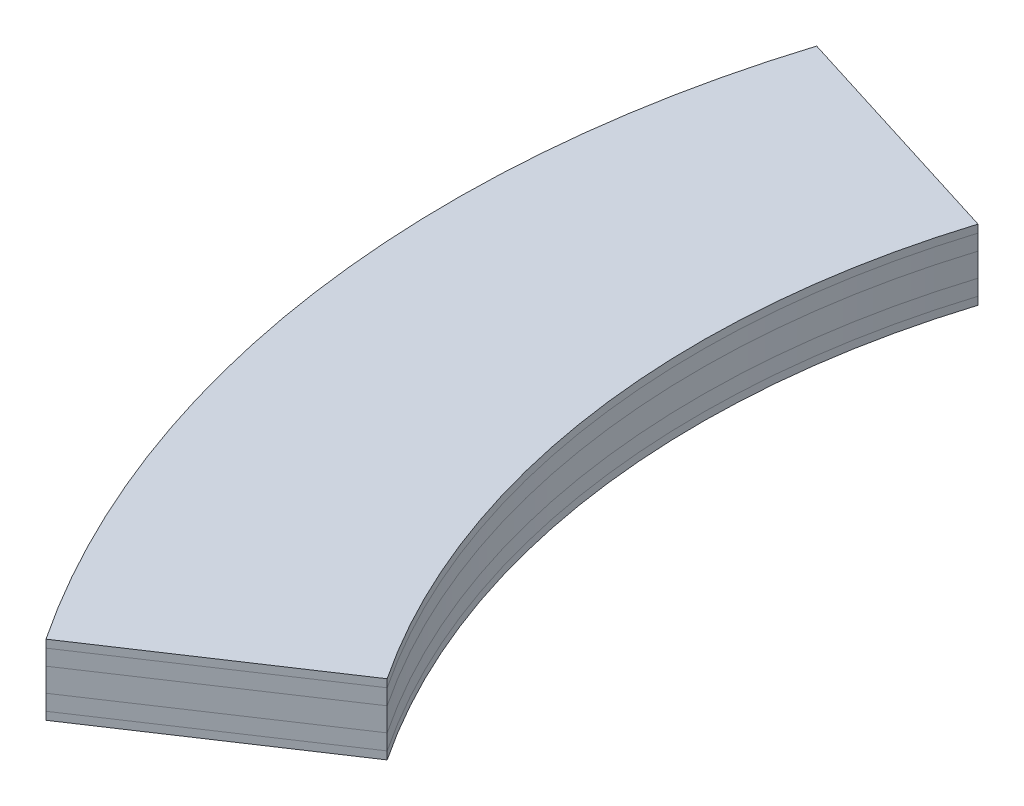
ISO-10303-21;
HEADER;
FILE_DESCRIPTION(('STEP AP214'),'2;1');
FILE_NAME('part.step','',(''),(''),'','','');
FILE_SCHEMA(('AUTOMOTIVE_DESIGN { 1 0 10303 214 1 1 1 1 }'));
ENDSEC;
DATA;
#1=APPLICATION_CONTEXT('core data for automotive mechanical design processes');
#2=APPLICATION_PROTOCOL_DEFINITION('international standard','automotive_design',2000,#1);
#3=PRODUCT_CONTEXT('',#1,'mechanical');
#4=PRODUCT('Part','Part','',(#3));
#5=PRODUCT_RELATED_PRODUCT_CATEGORY('part','',(#4));
#6=PRODUCT_DEFINITION_FORMATION('','',#4);
#7=PRODUCT_DEFINITION_CONTEXT('part definition',#1,'design');
#8=PRODUCT_DEFINITION('design','',#6,#7);
#9=PRODUCT_DEFINITION_SHAPE('','',#8);
#10=(LENGTH_UNIT() NAMED_UNIT(*) SI_UNIT(.MILLI.,.METRE.));
#11=(NAMED_UNIT(*) PLANE_ANGLE_UNIT() SI_UNIT($,.RADIAN.));
#12=(NAMED_UNIT(*) SI_UNIT($,.STERADIAN.) SOLID_ANGLE_UNIT());
#13=UNCERTAINTY_MEASURE_WITH_UNIT(LENGTH_MEASURE(1.E-05),#10,'distance_accuracy_value','');
#14=(GEOMETRIC_REPRESENTATION_CONTEXT(3) GLOBAL_UNCERTAINTY_ASSIGNED_CONTEXT((#13)) GLOBAL_UNIT_ASSIGNED_CONTEXT((#10,
#11,#12)) REPRESENTATION_CONTEXT('',''));
#15=CARTESIAN_POINT('',(0.,0.,0.));
#16=DIRECTION('',(0.,0.,1.));
#17=DIRECTION('',(1.,0.,0.));
#18=AXIS2_PLACEMENT_3D('',#15,#16,#17);
#19=CARTESIAN_POINT('',(0.,0.,0.));
#20=DIRECTION('',(0.,1.,0.));
#21=DIRECTION('',(0.,0.,1.));
#22=AXIS2_PLACEMENT_3D('',#19,#20,#21);
#23=PLANE('',#22);
#24=DIRECTION('',(-0.954350259490741,0.,-0.298689775871144));
#25=VECTOR('',#24,1.);
#26=CARTESIAN_POINT('',(46.2703573815659,0.,-282.443495848509));
#27=LINE('',#26,#25);
#28=CARTESIAN_POINT('',(131.112095450293,0.,-255.889974773564));
#29=VERTEX_POINT('',#28);
#30=CARTESIAN_POINT('',(46.2703573815659,0.,-282.443495848509));
#31=VERTEX_POINT('',#30);
#32=EDGE_CURVE('E100',#29,#31,#27,.T.);
#33=ORIENTED_EDGE('',*,*,#32,.T.);
#34=CARTESIAN_POINT('',(409.877806247538,0.,-168.642691241603));
#35=DIRECTION('',(0.,1.,0.));
#36=DIRECTION('',(0.,0.,-1.));
#37=AXIS2_PLACEMENT_3D('',#34,#35,#36);
#38=CIRCLE('',#37,381.);
#39=CARTESIAN_POINT('',(92.6123886277605,0.,42.316202343256));
#40=VERTEX_POINT('',#39);
#41=EDGE_CURVE('E110',#31,#40,#38,.T.);
#42=ORIENTED_EDGE('',*,*,#41,.T.);
#43=DIRECTION('',(0.832717631547974,0.,-0.553697883424827));
#44=VECTOR('',#43,1.);
#45=CARTESIAN_POINT('',(92.6123886277605,0.,42.3162023432561));
#46=LINE('',#45,#44);
#47=CARTESIAN_POINT('',(166.640986072375,0.,-6.907539493211));
#48=VERTEX_POINT('',#47);
#49=EDGE_CURVE('E108',#40,#48,#46,.T.);
#50=ORIENTED_EDGE('',*,*,#49,.T.);
#51=CARTESIAN_POINT('',(409.877806247538,0.,-168.642691241603));
#52=DIRECTION('',(0.,-1.,0.));
#53=DIRECTION('',(0.,0.,-1.));
#54=AXIS2_PLACEMENT_3D('',#51,#52,#53);
#55=CIRCLE('',#54,292.1);
#56=EDGE_CURVE('E72',#48,#29,#55,.T.);
#57=ORIENTED_EDGE('',*,*,#56,.T.);
#58=EDGE_LOOP('',(#33,#42,#50,#57));
#59=FACE_BOUND('',#58,.T.);
#60=ADVANCED_FACE('F49',(#59),#23,.T.);
#61=CARTESIAN_POINT('',(409.877806247538,-25.4,-168.642691241603));
#62=DIRECTION('',(0.,1.,0.));
#63=DIRECTION('',(0.,0.,1.));
#64=AXIS2_PLACEMENT_3D('',#61,#62,#63);
#65=CYLINDRICAL_SURFACE('',#64,381.);
#66=DIRECTION('',(0.,1.,0.));
#67=VECTOR('',#66,1.);
#68=CARTESIAN_POINT('',(92.6123886277605,-25.4,42.3162023432561));
#69=LINE('',#68,#67);
#70=CARTESIAN_POINT('',(92.6123886277605,-2.82222222222214,42.3162023432559));
#71=VERTEX_POINT('',#70);
#72=EDGE_CURVE('E64',#71,#40,#69,.T.);
#73=ORIENTED_EDGE('',*,*,#72,.T.);
#74=ORIENTED_EDGE('',*,*,#41,.F.);
#75=DIRECTION('',(0.,1.,0.));
#76=VECTOR('',#75,1.);
#77=CARTESIAN_POINT('',(46.2703573815659,-25.4,-282.443495848509));
#78=LINE('',#77,#76);
#79=CARTESIAN_POINT('',(46.2703573815659,-2.82222222222214,-282.443495848509));
#80=VERTEX_POINT('',#79);
#81=EDGE_CURVE('E96',#80,#31,#78,.T.);
#82=ORIENTED_EDGE('',*,*,#81,.F.);
#83=CARTESIAN_POINT('',(409.877806247538,-2.82222222222209,-168.642691241603));
#84=DIRECTION('',(0.,-1.,0.));
#85=DIRECTION('',(1.,0.,0.));
#86=AXIS2_PLACEMENT_3D('',#83,#84,#85);
#87=CIRCLE('',#86,381.);
#88=EDGE_CURVE('E12',#71,#80,#87,.T.);
#89=ORIENTED_EDGE('',*,*,#88,.F.);
#90=EDGE_LOOP('',(#73,#74,#82,#89));
#91=FACE_BOUND('',#90,.T.);
#92=ADVANCED_FACE('F122',(#91),#65,.T.);
#93=CARTESIAN_POINT('',(46.2703573815659,-25.4,-282.443495848509));
#94=DIRECTION('',(0.298689775871144,0.,-0.954350259490741));
#95=DIRECTION('',(-0.954350259490742,0.,-0.298689775871144));
#96=AXIS2_PLACEMENT_3D('',#93,#94,#95);
#97=PLANE('',#96);
#98=ORIENTED_EDGE('',*,*,#81,.T.);
#99=ORIENTED_EDGE('',*,*,#32,.F.);
#100=DIRECTION('',(0.,1.,0.));
#101=VECTOR('',#100,1.);
#102=CARTESIAN_POINT('',(131.112095450293,-25.4,-255.889974773564));
#103=LINE('',#102,#101);
#104=CARTESIAN_POINT('',(131.112095450293,-2.82222222222203,-255.889974773564));
#105=VERTEX_POINT('',#104);
#106=EDGE_CURVE('E89',#105,#29,#103,.T.);
#107=ORIENTED_EDGE('',*,*,#106,.F.);
#108=DIRECTION('',(0.954350259490742,0.,0.298689775871144));
#109=VECTOR('',#108,1.);
#110=CARTESIAN_POINT('',(-394.500100999854,-2.82222222222223,-420.394555341928));
#111=LINE('',#110,#109);
#112=EDGE_CURVE('E57',#80,#105,#111,.T.);
#113=ORIENTED_EDGE('',*,*,#112,.F.);
#114=EDGE_LOOP('',(#98,#99,#107,#113));
#115=FACE_BOUND('',#114,.T.);
#116=ADVANCED_FACE('F101',(#115),#97,.T.);
#117=CARTESIAN_POINT('',(409.877806247538,-25.4,-168.642691241603));
#118=DIRECTION('',(0.,1.,0.));
#119=DIRECTION('',(0.,0.,1.));
#120=AXIS2_PLACEMENT_3D('',#117,#118,#119);
#121=CYLINDRICAL_SURFACE('',#120,292.1);
#122=ORIENTED_EDGE('',*,*,#106,.T.);
#123=ORIENTED_EDGE('',*,*,#56,.F.);
#124=DIRECTION('',(0.,1.,0.));
#125=VECTOR('',#124,1.);
#126=CARTESIAN_POINT('',(166.640986072375,-25.4,-6.907539493211));
#127=LINE('',#126,#125);
#128=CARTESIAN_POINT('',(166.640986072375,-2.82222222222214,-6.907539493211));
#129=VERTEX_POINT('',#128);
#130=EDGE_CURVE('E97',#129,#48,#127,.T.);
#131=ORIENTED_EDGE('',*,*,#130,.F.);
#132=CARTESIAN_POINT('',(409.877806247538,-2.82222222222209,-168.642691241603));
#133=DIRECTION('',(0.,-1.,0.));
#134=DIRECTION('',(1.,0.,0.));
#135=AXIS2_PLACEMENT_3D('',#132,#133,#134);
#136=CIRCLE('',#135,292.1);
#137=EDGE_CURVE('E93',#105,#129,#136,.F.);
#138=ORIENTED_EDGE('',*,*,#137,.F.);
#139=EDGE_LOOP('',(#122,#123,#131,#138));
#140=FACE_BOUND('',#139,.T.);
#141=ADVANCED_FACE('F91',(#140),#121,.F.);
#142=CARTESIAN_POINT('',(92.6123886277605,-25.4,42.3162023432561));
#143=DIRECTION('',(0.553697883424827,0.,0.832717631547973));
#144=DIRECTION('',(0.832717631547973,0.,-0.553697883424827));
#145=AXIS2_PLACEMENT_3D('',#142,#143,#144);
#146=PLANE('',#145);
#147=ORIENTED_EDGE('',*,*,#130,.T.);
#148=ORIENTED_EDGE('',*,*,#49,.F.);
#149=ORIENTED_EDGE('',*,*,#72,.F.);
#150=DIRECTION('',(-0.832717631547973,0.,0.553697883424827));
#151=VECTOR('',#150,1.);
#152=CARTESIAN_POINT('',(96.4900398465763,-2.82222222222214,39.7378406139303));
#153=LINE('',#152,#151);
#154=EDGE_CURVE('E114',#129,#71,#153,.T.);
#155=ORIENTED_EDGE('',*,*,#154,.F.);
#156=EDGE_LOOP('',(#147,#148,#149,#155));
#157=FACE_BOUND('',#156,.T.);
#158=ADVANCED_FACE('F123',(#157),#146,.T.);
#159=CARTESIAN_POINT('',(-335.28,-2.82222222222222,-609.61));
#160=DIRECTION('',(0.,-1.,0.));
#161=DIRECTION('',(1.,0.,0.));
#162=AXIS2_PLACEMENT_3D('',#159,#160,#161);
#163=PLANE('',#162);
#164=ORIENTED_EDGE('',*,*,#154,.T.);
#165=ORIENTED_EDGE('',*,*,#88,.T.);
#166=ORIENTED_EDGE('',*,*,#112,.T.);
#167=ORIENTED_EDGE('',*,*,#137,.T.);
#168=EDGE_LOOP('',(#164,#165,#166,#167));
#169=FACE_BOUND('',#168,.T.);
#170=ADVANCED_FACE('F51',(#169),#163,.T.);
#171=CLOSED_SHELL('',(#60,#92,#116,#141,#158,#170));
#172=MANIFOLD_SOLID_BREP('B2',#171);
#173=CARTESIAN_POINT('',(0.,-25.4,0.));
#174=DIRECTION('',(0.,1.,0.));
#175=DIRECTION('',(0.,0.,1.));
#176=AXIS2_PLACEMENT_3D('',#173,#174,#175);
#177=PLANE('',#176);
#178=CARTESIAN_POINT('',(409.877806247538,-25.4,-168.642691241603));
#179=DIRECTION('',(0.,1.,0.));
#180=DIRECTION('',(0.,0.,-1.));
#181=AXIS2_PLACEMENT_3D('',#178,#179,#180);
#182=CIRCLE('',#181,381.);
#183=CARTESIAN_POINT('',(46.2703573815659,-25.4,-282.443495848509));
#184=VERTEX_POINT('',#183);
#185=CARTESIAN_POINT('',(92.6123886277605,-25.4,42.316202343256));
#186=VERTEX_POINT('',#185);
#187=EDGE_CURVE('E205',#184,#186,#182,.T.);
#188=ORIENTED_EDGE('',*,*,#187,.F.);
#189=DIRECTION('',(-0.954350259490741,0.,-0.298689775871144));
#190=VECTOR('',#189,1.);
#191=CARTESIAN_POINT('',(46.2703573815659,-25.4,-282.443495848509));
#192=LINE('',#191,#190);
#193=CARTESIAN_POINT('',(131.112095450293,-25.4,-255.889974773564));
#194=VERTEX_POINT('',#193);
#195=EDGE_CURVE('E228',#194,#184,#192,.T.);
#196=ORIENTED_EDGE('',*,*,#195,.F.);
#197=CARTESIAN_POINT('',(409.877806247538,-25.4,-168.642691241603));
#198=DIRECTION('',(0.,-1.,0.));
#199=DIRECTION('',(0.,0.,-1.));
#200=AXIS2_PLACEMENT_3D('',#197,#198,#199);
#201=CIRCLE('',#200,292.1);
#202=CARTESIAN_POINT('',(166.640986072375,-25.4,-6.907539493211));
#203=VERTEX_POINT('',#202);
#204=EDGE_CURVE('E235',#203,#194,#201,.T.);
#205=ORIENTED_EDGE('',*,*,#204,.F.);
#206=DIRECTION('',(0.832717631547974,0.,-0.553697883424827));
#207=VECTOR('',#206,1.);
#208=CARTESIAN_POINT('',(92.6123886277605,-25.4,42.3162023432561));
#209=LINE('',#208,#207);
#210=EDGE_CURVE('E239',#186,#203,#209,.T.);
#211=ORIENTED_EDGE('',*,*,#210,.F.);
#212=EDGE_LOOP('',(#188,#196,#205,#211));
#213=FACE_BOUND('',#212,.T.);
#214=ADVANCED_FACE('F182',(#213),#177,.F.);
#215=CARTESIAN_POINT('',(409.877806247538,-25.4,-168.642691241603));
#216=DIRECTION('',(0.,1.,0.));
#217=DIRECTION('',(0.,0.,1.));
#218=AXIS2_PLACEMENT_3D('',#215,#216,#217);
#219=CYLINDRICAL_SURFACE('',#218,381.);
#220=CARTESIAN_POINT('',(409.877806247538,-22.5777777777776,-168.642691241603));
#221=DIRECTION('',(0.,-1.,0.));
#222=DIRECTION('',(1.,0.,0.));
#223=AXIS2_PLACEMENT_3D('',#220,#221,#222);
#224=CIRCLE('',#223,381.);
#225=CARTESIAN_POINT('',(92.6123886277605,-22.5777777777777,42.3162023432561));
#226=VERTEX_POINT('',#225);
#227=CARTESIAN_POINT('',(46.2703573815659,-22.5777777777777,-282.443495848509));
#228=VERTEX_POINT('',#227);
#229=EDGE_CURVE('E47',#226,#228,#224,.T.);
#230=ORIENTED_EDGE('',*,*,#229,.T.);
#231=DIRECTION('',(0.,1.,0.));
#232=VECTOR('',#231,1.);
#233=CARTESIAN_POINT('',(46.2703573815659,-25.4,-282.443495848509));
#234=LINE('',#233,#232);
#235=EDGE_CURVE('E232',#184,#228,#234,.T.);
#236=ORIENTED_EDGE('',*,*,#235,.F.);
#237=ORIENTED_EDGE('',*,*,#187,.T.);
#238=DIRECTION('',(0.,1.,0.));
#239=VECTOR('',#238,1.);
#240=CARTESIAN_POINT('',(92.6123886277605,-25.4,42.3162023432561));
#241=LINE('',#240,#239);
#242=EDGE_CURVE('E241',#186,#226,#241,.T.);
#243=ORIENTED_EDGE('',*,*,#242,.T.);
#244=EDGE_LOOP('',(#230,#236,#237,#243));
#245=FACE_BOUND('',#244,.T.);
#246=ADVANCED_FACE('F255',(#245),#219,.T.);
#247=CARTESIAN_POINT('',(46.2703573815659,-25.4,-282.443495848509));
#248=DIRECTION('',(0.298689775871144,0.,-0.954350259490741));
#249=DIRECTION('',(-0.954350259490742,0.,-0.298689775871144));
#250=AXIS2_PLACEMENT_3D('',#247,#248,#249);
#251=PLANE('',#250);
#252=DIRECTION('',(0.954350259490742,0.,0.298689775871144));
#253=VECTOR('',#252,1.);
#254=CARTESIAN_POINT('',(-394.500100999854,-22.5777777777778,-420.394555341928));
#255=LINE('',#254,#253);
#256=CARTESIAN_POINT('',(131.112095450293,-22.5777777777776,-255.889974773564));
#257=VERTEX_POINT('',#256);
#258=EDGE_CURVE('E190',#228,#257,#255,.T.);
#259=ORIENTED_EDGE('',*,*,#258,.T.);
#260=DIRECTION('',(0.,1.,0.));
#261=VECTOR('',#260,1.);
#262=CARTESIAN_POINT('',(131.112095450293,-25.4,-255.889974773564));
#263=LINE('',#262,#261);
#264=EDGE_CURVE('E223',#194,#257,#263,.T.);
#265=ORIENTED_EDGE('',*,*,#264,.F.);
#266=ORIENTED_EDGE('',*,*,#195,.T.);
#267=ORIENTED_EDGE('',*,*,#235,.T.);
#268=EDGE_LOOP('',(#259,#265,#266,#267));
#269=FACE_BOUND('',#268,.T.);
#270=ADVANCED_FACE('F225',(#269),#251,.T.);
#271=CARTESIAN_POINT('',(409.877806247538,-25.4,-168.642691241603));
#272=DIRECTION('',(0.,1.,0.));
#273=DIRECTION('',(0.,0.,1.));
#274=AXIS2_PLACEMENT_3D('',#271,#272,#273);
#275=CYLINDRICAL_SURFACE('',#274,292.1);
#276=CARTESIAN_POINT('',(409.877806247538,-22.5777777777776,-168.642691241603));
#277=DIRECTION('',(0.,-1.,0.));
#278=DIRECTION('',(1.,0.,0.));
#279=AXIS2_PLACEMENT_3D('',#276,#277,#278);
#280=CIRCLE('',#279,292.1);
#281=CARTESIAN_POINT('',(166.640986072375,-22.5777777777777,-6.90753949321113));
#282=VERTEX_POINT('',#281);
#283=EDGE_CURVE('E250',#257,#282,#280,.F.);
#284=ORIENTED_EDGE('',*,*,#283,.T.);
#285=DIRECTION('',(0.,1.,0.));
#286=VECTOR('',#285,1.);
#287=CARTESIAN_POINT('',(166.640986072375,-25.4,-6.907539493211));
#288=LINE('',#287,#286);
#289=EDGE_CURVE('E197',#203,#282,#288,.T.);
#290=ORIENTED_EDGE('',*,*,#289,.F.);
#291=ORIENTED_EDGE('',*,*,#204,.T.);
#292=ORIENTED_EDGE('',*,*,#264,.T.);
#293=EDGE_LOOP('',(#284,#290,#291,#292));
#294=FACE_BOUND('',#293,.T.);
#295=ADVANCED_FACE('F236',(#294),#275,.F.);
#296=CARTESIAN_POINT('',(92.6123886277605,-25.4,42.3162023432561));
#297=DIRECTION('',(0.553697883424827,0.,0.832717631547973));
#298=DIRECTION('',(0.832717631547973,0.,-0.553697883424827));
#299=AXIS2_PLACEMENT_3D('',#296,#297,#298);
#300=PLANE('',#299);
#301=DIRECTION('',(-0.832717631547973,0.,0.553697883424827));
#302=VECTOR('',#301,1.);
#303=CARTESIAN_POINT('',(96.4900398465763,-22.5777777777777,39.7378406139303));
#304=LINE('',#303,#302);
#305=EDGE_CURVE('E246',#282,#226,#304,.T.);
#306=ORIENTED_EDGE('',*,*,#305,.T.);
#307=ORIENTED_EDGE('',*,*,#242,.F.);
#308=ORIENTED_EDGE('',*,*,#210,.T.);
#309=ORIENTED_EDGE('',*,*,#289,.T.);
#310=EDGE_LOOP('',(#306,#307,#308,#309));
#311=FACE_BOUND('',#310,.T.);
#312=ADVANCED_FACE('F254',(#311),#300,.T.);
#313=CARTESIAN_POINT('',(-335.28,-22.5777777777778,-609.61));
#314=DIRECTION('',(0.,-1.,0.));
#315=DIRECTION('',(1.,0.,0.));
#316=AXIS2_PLACEMENT_3D('',#313,#314,#315);
#317=PLANE('',#316);
#318=ORIENTED_EDGE('',*,*,#229,.F.);
#319=ORIENTED_EDGE('',*,*,#305,.F.);
#320=ORIENTED_EDGE('',*,*,#283,.F.);
#321=ORIENTED_EDGE('',*,*,#258,.F.);
#322=EDGE_LOOP('',(#318,#319,#320,#321));
#323=FACE_BOUND('',#322,.T.);
#324=ADVANCED_FACE('F184',(#323),#317,.F.);
#325=CLOSED_SHELL('',(#214,#246,#270,#295,#312,#324));
#326=MANIFOLD_SOLID_BREP('B6',#325);
#327=CARTESIAN_POINT('',(-335.28,-22.5777777777778,-609.61));
#328=DIRECTION('',(0.,-1.,0.));
#329=DIRECTION('',(1.,0.,0.));
#330=AXIS2_PLACEMENT_3D('',#327,#328,#329);
#331=PLANE('',#330);
#332=DIRECTION('',(-0.832717631547973,0.,0.553697883424827));
#333=VECTOR('',#332,1.);
#334=CARTESIAN_POINT('',(96.4900398465763,-22.5777777777777,39.7378406139303));
#335=LINE('',#334,#333);
#336=CARTESIAN_POINT('',(166.640986072375,-22.5777777777777,-6.907539493211));
#337=VERTEX_POINT('',#336);
#338=CARTESIAN_POINT('',(92.6123886277605,-22.5777777777777,42.3162023432559));
#339=VERTEX_POINT('',#338);
#340=EDGE_CURVE('E352',#337,#339,#335,.T.);
#341=ORIENTED_EDGE('',*,*,#340,.T.);
#342=CARTESIAN_POINT('',(409.877806247538,-22.5777777777776,-168.642691241603));
#343=DIRECTION('',(0.,-1.,0.));
#344=DIRECTION('',(1.,0.,0.));
#345=AXIS2_PLACEMENT_3D('',#342,#343,#344);
#346=CIRCLE('',#345,381.);
#347=CARTESIAN_POINT('',(46.2703573815659,-22.5777777777777,-282.443495848509));
#348=VERTEX_POINT('',#347);
#349=EDGE_CURVE('E180',#339,#348,#346,.T.);
#350=ORIENTED_EDGE('',*,*,#349,.T.);
#351=DIRECTION('',(0.954350259490742,0.,0.298689775871144));
#352=VECTOR('',#351,1.);
#353=CARTESIAN_POINT('',(-394.500100999854,-22.5777777777778,-420.394555341928));
#354=LINE('',#353,#352);
#355=CARTESIAN_POINT('',(131.112095450293,-22.5777777777776,-255.889974773564));
#356=VERTEX_POINT('',#355);
#357=EDGE_CURVE('E322',#348,#356,#354,.T.);
#358=ORIENTED_EDGE('',*,*,#357,.T.);
#359=CARTESIAN_POINT('',(409.877806247538,-22.5777777777776,-168.642691241603));
#360=DIRECTION('',(0.,-1.,0.));
#361=DIRECTION('',(1.,0.,0.));
#362=AXIS2_PLACEMENT_3D('',#359,#360,#361);
#363=CIRCLE('',#362,292.1);
#364=EDGE_CURVE('E356',#356,#337,#363,.F.);
#365=ORIENTED_EDGE('',*,*,#364,.T.);
#366=EDGE_LOOP('',(#341,#350,#358,#365));
#367=FACE_BOUND('',#366,.T.);
#368=ADVANCED_FACE('F315',(#367),#331,.T.);
#369=CARTESIAN_POINT('',(409.877806247538,-25.4,-168.642691241603));
#370=DIRECTION('',(0.,1.,0.));
#371=DIRECTION('',(0.,0.,1.));
#372=AXIS2_PLACEMENT_3D('',#369,#370,#371);
#373=CYLINDRICAL_SURFACE('',#372,381.);
#374=CARTESIAN_POINT('',(409.877806247538,-16.9333333333332,-168.642691241603));
#375=DIRECTION('',(0.,-1.,0.));
#376=DIRECTION('',(1.,0.,0.));
#377=AXIS2_PLACEMENT_3D('',#374,#375,#376);
#378=CIRCLE('',#377,381.);
#379=CARTESIAN_POINT('',(92.6123886277605,-16.9333333333332,42.3162023432561));
#380=VERTEX_POINT('',#379);
#381=CARTESIAN_POINT('',(46.2703573815659,-16.9333333333333,-282.443495848509));
#382=VERTEX_POINT('',#381);
#383=EDGE_CURVE('E357',#380,#382,#378,.T.);
#384=ORIENTED_EDGE('',*,*,#383,.T.);
#385=DIRECTION('',(0.,1.,0.));
#386=VECTOR('',#385,1.);
#387=CARTESIAN_POINT('',(46.2703573815659,-25.4,-282.443495848509));
#388=LINE('',#387,#386);
#389=EDGE_CURVE('E377',#348,#382,#388,.T.);
#390=ORIENTED_EDGE('',*,*,#389,.F.);
#391=ORIENTED_EDGE('',*,*,#349,.F.);
#392=DIRECTION('',(0.,1.,0.));
#393=VECTOR('',#392,1.);
#394=CARTESIAN_POINT('',(92.6123886277605,-25.4,42.3162023432561));
#395=LINE('',#394,#393);
#396=EDGE_CURVE('E334',#339,#380,#395,.T.);
#397=ORIENTED_EDGE('',*,*,#396,.T.);
#398=EDGE_LOOP('',(#384,#390,#391,#397));
#399=FACE_BOUND('',#398,.T.);
#400=ADVANCED_FACE('F389',(#399),#373,.T.);
#401=CARTESIAN_POINT('',(46.2703573815659,-25.4,-282.443495848509));
#402=DIRECTION('',(0.298689775871144,0.,-0.954350259490741));
#403=DIRECTION('',(-0.954350259490742,0.,-0.298689775871144));
#404=AXIS2_PLACEMENT_3D('',#401,#402,#403);
#405=PLANE('',#404);
#406=DIRECTION('',(0.954350259490742,0.,0.298689775871144));
#407=VECTOR('',#406,1.);
#408=CARTESIAN_POINT('',(-394.500100999854,-16.9333333333333,-420.394555341928));
#409=LINE('',#408,#407);
#410=CARTESIAN_POINT('',(131.112095450293,-16.9333333333331,-255.889974773564));
#411=VERTEX_POINT('',#410);
#412=EDGE_CURVE('E372',#382,#411,#409,.T.);
#413=ORIENTED_EDGE('',*,*,#412,.T.);
#414=DIRECTION('',(0.,1.,0.));
#415=VECTOR('',#414,1.);
#416=CARTESIAN_POINT('',(131.112095450293,-25.4,-255.889974773564));
#417=LINE('',#416,#415);
#418=EDGE_CURVE('E366',#356,#411,#417,.T.);
#419=ORIENTED_EDGE('',*,*,#418,.F.);
#420=ORIENTED_EDGE('',*,*,#357,.F.);
#421=ORIENTED_EDGE('',*,*,#389,.T.);
#422=EDGE_LOOP('',(#413,#419,#420,#421));
#423=FACE_BOUND('',#422,.T.);
#424=ADVANCED_FACE('F384',(#423),#405,.T.);
#425=CARTESIAN_POINT('',(409.877806247538,-25.4,-168.642691241603));
#426=DIRECTION('',(0.,1.,0.));
#427=DIRECTION('',(0.,0.,1.));
#428=AXIS2_PLACEMENT_3D('',#425,#426,#427);
#429=CYLINDRICAL_SURFACE('',#428,292.1);
#430=CARTESIAN_POINT('',(409.877806247538,-16.9333333333332,-168.642691241603));
#431=DIRECTION('',(0.,-1.,0.));
#432=DIRECTION('',(1.,0.,0.));
#433=AXIS2_PLACEMENT_3D('',#430,#431,#432);
#434=CIRCLE('',#433,292.1);
#435=CARTESIAN_POINT('',(166.640986072375,-16.9333333333332,-6.90753949321113));
#436=VERTEX_POINT('',#435);
#437=EDGE_CURVE('E364',#411,#436,#434,.F.);
#438=ORIENTED_EDGE('',*,*,#437,.T.);
#439=DIRECTION('',(0.,1.,0.));
#440=VECTOR('',#439,1.);
#441=CARTESIAN_POINT('',(166.640986072375,-25.4,-6.907539493211));
#442=LINE('',#441,#440);
#443=EDGE_CURVE('E329',#337,#436,#442,.T.);
#444=ORIENTED_EDGE('',*,*,#443,.F.);
#445=ORIENTED_EDGE('',*,*,#364,.F.);
#446=ORIENTED_EDGE('',*,*,#418,.T.);
#447=EDGE_LOOP('',(#438,#444,#445,#446));
#448=FACE_BOUND('',#447,.T.);
#449=ADVANCED_FACE('F360',(#448),#429,.F.);
#450=CARTESIAN_POINT('',(92.6123886277605,-25.4,42.3162023432561));
#451=DIRECTION('',(0.553697883424827,0.,0.832717631547973));
#452=DIRECTION('',(0.832717631547973,0.,-0.553697883424827));
#453=AXIS2_PLACEMENT_3D('',#450,#451,#452);
#454=PLANE('',#453);
#455=DIRECTION('',(-0.832717631547973,0.,0.553697883424827));
#456=VECTOR('',#455,1.);
#457=CARTESIAN_POINT('',(96.4900398465763,-16.9333333333333,39.7378406139303));
#458=LINE('',#457,#456);
#459=EDGE_CURVE('E375',#436,#380,#458,.T.);
#460=ORIENTED_EDGE('',*,*,#459,.T.);
#461=ORIENTED_EDGE('',*,*,#396,.F.);
#462=ORIENTED_EDGE('',*,*,#340,.F.);
#463=ORIENTED_EDGE('',*,*,#443,.T.);
#464=EDGE_LOOP('',(#460,#461,#462,#463));
#465=FACE_BOUND('',#464,.T.);
#466=ADVANCED_FACE('F353',(#465),#454,.T.);
#467=CARTESIAN_POINT('',(-335.28,-16.9333333333333,-609.61));
#468=DIRECTION('',(0.,-1.,0.));
#469=DIRECTION('',(1.,0.,0.));
#470=AXIS2_PLACEMENT_3D('',#467,#468,#469);
#471=PLANE('',#470);
#472=ORIENTED_EDGE('',*,*,#383,.F.);
#473=ORIENTED_EDGE('',*,*,#459,.F.);
#474=ORIENTED_EDGE('',*,*,#437,.F.);
#475=ORIENTED_EDGE('',*,*,#412,.F.);
#476=EDGE_LOOP('',(#472,#473,#474,#475));
#477=FACE_BOUND('',#476,.T.);
#478=ADVANCED_FACE('F388',(#477),#471,.F.);
#479=CLOSED_SHELL('',(#368,#400,#424,#449,#466,#478));
#480=MANIFOLD_SOLID_BREP('B41',#479);
#481=CARTESIAN_POINT('',(-335.28,-16.9333333333333,-609.61));
#482=DIRECTION('',(0.,-1.,0.));
#483=DIRECTION('',(1.,0.,0.));
#484=AXIS2_PLACEMENT_3D('',#481,#482,#483);
#485=PLANE('',#484);
#486=DIRECTION('',(-0.832717631547973,0.,0.553697883424827));
#487=VECTOR('',#486,1.);
#488=CARTESIAN_POINT('',(96.4900398465763,-16.9333333333333,39.7378406139303));
#489=LINE('',#488,#487);
#490=CARTESIAN_POINT('',(166.640986072375,-16.9333333333332,-6.907539493211));
#491=VERTEX_POINT('',#490);
#492=CARTESIAN_POINT('',(92.6123886277605,-16.9333333333333,42.3162023432559));
#493=VERTEX_POINT('',#492);
#494=EDGE_CURVE('E485',#491,#493,#489,.T.);
#495=ORIENTED_EDGE('',*,*,#494,.T.);
#496=CARTESIAN_POINT('',(409.877806247538,-16.9333333333332,-168.642691241603));
#497=DIRECTION('',(0.,-1.,0.));
#498=DIRECTION('',(1.,0.,0.));
#499=AXIS2_PLACEMENT_3D('',#496,#497,#498);
#500=CIRCLE('',#499,381.);
#501=CARTESIAN_POINT('',(46.2703573815659,-16.9333333333333,-282.443495848509));
#502=VERTEX_POINT('',#501);
#503=EDGE_CURVE('E313',#493,#502,#500,.T.);
#504=ORIENTED_EDGE('',*,*,#503,.T.);
#505=DIRECTION('',(0.954350259490742,0.,0.298689775871144));
#506=VECTOR('',#505,1.);
#507=CARTESIAN_POINT('',(-394.500100999854,-16.9333333333333,-420.394555341928));
#508=LINE('',#507,#506);
#509=CARTESIAN_POINT('',(131.112095450293,-16.9333333333331,-255.889974773564));
#510=VERTEX_POINT('',#509);
#511=EDGE_CURVE('E455',#502,#510,#508,.T.);
#512=ORIENTED_EDGE('',*,*,#511,.T.);
#513=CARTESIAN_POINT('',(409.877806247538,-16.9333333333332,-168.642691241603));
#514=DIRECTION('',(0.,-1.,0.));
#515=DIRECTION('',(1.,0.,0.));
#516=AXIS2_PLACEMENT_3D('',#513,#514,#515);
#517=CIRCLE('',#516,292.1);
#518=EDGE_CURVE('E490',#510,#491,#517,.F.);
#519=ORIENTED_EDGE('',*,*,#518,.T.);
#520=EDGE_LOOP('',(#495,#504,#512,#519));
#521=FACE_BOUND('',#520,.T.);
#522=ADVANCED_FACE('F447',(#521),#485,.T.);
#523=CARTESIAN_POINT('',(409.877806247538,-25.4,-168.642691241603));
#524=DIRECTION('',(0.,1.,0.));
#525=DIRECTION('',(0.,0.,1.));
#526=AXIS2_PLACEMENT_3D('',#523,#524,#525);
#527=CYLINDRICAL_SURFACE('',#526,381.);
#528=CARTESIAN_POINT('',(409.877806247538,-8.46666666666653,-168.642691241603));
#529=DIRECTION('',(0.,-1.,0.));
#530=DIRECTION('',(1.,0.,0.));
#531=AXIS2_PLACEMENT_3D('',#528,#529,#530);
#532=CIRCLE('',#531,381.);
#533=CARTESIAN_POINT('',(92.6123886277605,-8.46666666666658,42.3162023432561));
#534=VERTEX_POINT('',#533);
#535=CARTESIAN_POINT('',(46.2703573815659,-8.46666666666659,-282.443495848509));
#536=VERTEX_POINT('',#535);
#537=EDGE_CURVE('E491',#534,#536,#532,.T.);
#538=ORIENTED_EDGE('',*,*,#537,.T.);
#539=DIRECTION('',(0.,1.,0.));
#540=VECTOR('',#539,1.);
#541=CARTESIAN_POINT('',(46.2703573815659,-25.4,-282.443495848509));
#542=LINE('',#541,#540);
#543=EDGE_CURVE('E518',#502,#536,#542,.T.);
#544=ORIENTED_EDGE('',*,*,#543,.F.);
#545=ORIENTED_EDGE('',*,*,#503,.F.);
#546=DIRECTION('',(0.,1.,0.));
#547=VECTOR('',#546,1.);
#548=CARTESIAN_POINT('',(92.6123886277605,-25.4,42.3162023432561));
#549=LINE('',#548,#547);
#550=EDGE_CURVE('E467',#493,#534,#549,.T.);
#551=ORIENTED_EDGE('',*,*,#550,.T.);
#552=EDGE_LOOP('',(#538,#544,#545,#551));
#553=FACE_BOUND('',#552,.T.);
#554=ADVANCED_FACE('F533',(#553),#527,.T.);
#555=CARTESIAN_POINT('',(46.2703573815659,-25.4,-282.443495848509));
#556=DIRECTION('',(0.298689775871144,0.,-0.954350259490741));
#557=DIRECTION('',(-0.954350259490742,0.,-0.298689775871144));
#558=AXIS2_PLACEMENT_3D('',#555,#556,#557);
#559=PLANE('',#558);
#560=DIRECTION('',(0.954350259490742,0.,0.298689775871144));
#561=VECTOR('',#560,1.);
#562=CARTESIAN_POINT('',(-394.500100999854,-8.46666666666668,-420.394555341928));
#563=LINE('',#562,#561);
#564=CARTESIAN_POINT('',(131.112095450293,-8.46666666666648,-255.889974773564));
#565=VERTEX_POINT('',#564);
#566=EDGE_CURVE('E510',#536,#565,#563,.T.);
#567=ORIENTED_EDGE('',*,*,#566,.T.);
#568=DIRECTION('',(0.,1.,0.));
#569=VECTOR('',#568,1.);
#570=CARTESIAN_POINT('',(131.112095450293,-25.4,-255.889974773564));
#571=LINE('',#570,#569);
#572=EDGE_CURVE('E501',#510,#565,#571,.T.);
#573=ORIENTED_EDGE('',*,*,#572,.F.);
#574=ORIENTED_EDGE('',*,*,#511,.F.);
#575=ORIENTED_EDGE('',*,*,#543,.T.);
#576=EDGE_LOOP('',(#567,#573,#574,#575));
#577=FACE_BOUND('',#576,.T.);
#578=ADVANCED_FACE('F528',(#577),#559,.T.);
#579=CARTESIAN_POINT('',(409.877806247538,-25.4,-168.642691241603));
#580=DIRECTION('',(0.,1.,0.));
#581=DIRECTION('',(0.,0.,1.));
#582=AXIS2_PLACEMENT_3D('',#579,#580,#581);
#583=CYLINDRICAL_SURFACE('',#582,292.1);
#584=CARTESIAN_POINT('',(409.877806247538,-8.46666666666653,-168.642691241603));
#585=DIRECTION('',(0.,-1.,0.));
#586=DIRECTION('',(1.,0.,0.));
#587=AXIS2_PLACEMENT_3D('',#584,#585,#586);
#588=CIRCLE('',#587,292.1);
#589=CARTESIAN_POINT('',(166.640986072375,-8.46666666666658,-6.90753949321113));
#590=VERTEX_POINT('',#589);
#591=EDGE_CURVE('E498',#565,#590,#588,.F.);
#592=ORIENTED_EDGE('',*,*,#591,.T.);
#593=DIRECTION('',(0.,1.,0.));
#594=VECTOR('',#593,1.);
#595=CARTESIAN_POINT('',(166.640986072375,-25.4,-6.907539493211));
#596=LINE('',#595,#594);
#597=EDGE_CURVE('E462',#491,#590,#596,.T.);
#598=ORIENTED_EDGE('',*,*,#597,.F.);
#599=ORIENTED_EDGE('',*,*,#518,.F.);
#600=ORIENTED_EDGE('',*,*,#572,.T.);
#601=EDGE_LOOP('',(#592,#598,#599,#600));
#602=FACE_BOUND('',#601,.T.);
#603=ADVANCED_FACE('F494',(#602),#583,.F.);
#604=CARTESIAN_POINT('',(92.6123886277605,-25.4,42.3162023432561));
#605=DIRECTION('',(0.553697883424827,0.,0.832717631547973));
#606=DIRECTION('',(0.832717631547973,0.,-0.553697883424827));
#607=AXIS2_PLACEMENT_3D('',#604,#605,#606);
#608=PLANE('',#607);
#609=DIRECTION('',(-0.832717631547973,0.,0.553697883424827));
#610=VECTOR('',#609,1.);
#611=CARTESIAN_POINT('',(96.4900398465763,-8.46666666666659,39.7378406139303));
#612=LINE('',#611,#610);
#613=EDGE_CURVE('E515',#590,#534,#612,.T.);
#614=ORIENTED_EDGE('',*,*,#613,.T.);
#615=ORIENTED_EDGE('',*,*,#550,.F.);
#616=ORIENTED_EDGE('',*,*,#494,.F.);
#617=ORIENTED_EDGE('',*,*,#597,.T.);
#618=EDGE_LOOP('',(#614,#615,#616,#617));
#619=FACE_BOUND('',#618,.T.);
#620=ADVANCED_FACE('F486',(#619),#608,.T.);
#621=CARTESIAN_POINT('',(-335.28,-8.46666666666667,-609.61));
#622=DIRECTION('',(0.,-1.,0.));
#623=DIRECTION('',(1.,0.,0.));
#624=AXIS2_PLACEMENT_3D('',#621,#622,#623);
#625=PLANE('',#624);
#626=ORIENTED_EDGE('',*,*,#537,.F.);
#627=ORIENTED_EDGE('',*,*,#613,.F.);
#628=ORIENTED_EDGE('',*,*,#591,.F.);
#629=ORIENTED_EDGE('',*,*,#566,.F.);
#630=EDGE_LOOP('',(#626,#627,#628,#629));
#631=FACE_BOUND('',#630,.T.);
#632=ADVANCED_FACE('F532',(#631),#625,.F.);
#633=CLOSED_SHELL('',(#522,#554,#578,#603,#620,#632));
#634=MANIFOLD_SOLID_BREP('B174',#633);
#635=CARTESIAN_POINT('',(-335.28,-8.46666666666667,-609.61));
#636=DIRECTION('',(0.,-1.,0.));
#637=DIRECTION('',(1.,0.,0.));
#638=AXIS2_PLACEMENT_3D('',#635,#636,#637);
#639=PLANE('',#638);
#640=DIRECTION('',(-0.832717631547973,0.,0.553697883424827));
#641=VECTOR('',#640,1.);
#642=CARTESIAN_POINT('',(96.4900398465763,-8.46666666666659,39.7378406139303));
#643=LINE('',#642,#641);
#644=CARTESIAN_POINT('',(166.640986072375,-8.46666666666658,-6.907539493211));
#645=VERTEX_POINT('',#644);
#646=CARTESIAN_POINT('',(92.6123886277605,-8.46666666666659,42.3162023432559));
#647=VERTEX_POINT('',#646);
#648=EDGE_CURVE('E620',#645,#647,#643,.T.);
#649=ORIENTED_EDGE('',*,*,#648,.T.);
#650=CARTESIAN_POINT('',(409.877806247538,-8.46666666666653,-168.642691241603));
#651=DIRECTION('',(0.,-1.,0.));
#652=DIRECTION('',(1.,0.,0.));
#653=AXIS2_PLACEMENT_3D('',#650,#651,#652);
#654=CIRCLE('',#653,381.);
#655=CARTESIAN_POINT('',(46.2703573815659,-8.46666666666659,-282.443495848509));
#656=VERTEX_POINT('',#655);
#657=EDGE_CURVE('E445',#647,#656,#654,.T.);
#658=ORIENTED_EDGE('',*,*,#657,.T.);
#659=DIRECTION('',(0.954350259490742,0.,0.298689775871144));
#660=VECTOR('',#659,1.);
#661=CARTESIAN_POINT('',(-394.500100999854,-8.46666666666668,-420.394555341928));
#662=LINE('',#661,#660);
#663=CARTESIAN_POINT('',(131.112095450293,-8.46666666666648,-255.889974773564));
#664=VERTEX_POINT('',#663);
#665=EDGE_CURVE('E590',#656,#664,#662,.T.);
#666=ORIENTED_EDGE('',*,*,#665,.T.);
#667=CARTESIAN_POINT('',(409.877806247538,-8.46666666666653,-168.642691241603));
#668=DIRECTION('',(0.,-1.,0.));
#669=DIRECTION('',(1.,0.,0.));
#670=AXIS2_PLACEMENT_3D('',#667,#668,#669);
#671=CIRCLE('',#670,292.1);
#672=EDGE_CURVE('E624',#664,#645,#671,.F.);
#673=ORIENTED_EDGE('',*,*,#672,.T.);
#674=EDGE_LOOP('',(#649,#658,#666,#673));
#675=FACE_BOUND('',#674,.T.);
#676=ADVANCED_FACE('F582',(#675),#639,.T.);
#677=CARTESIAN_POINT('',(409.877806247538,-25.4,-168.642691241603));
#678=DIRECTION('',(0.,1.,0.));
#679=DIRECTION('',(0.,0.,1.));
#680=AXIS2_PLACEMENT_3D('',#677,#678,#679);
#681=CYLINDRICAL_SURFACE('',#680,381.);
#682=CARTESIAN_POINT('',(409.877806247538,-2.82222222222209,-168.642691241603));
#683=DIRECTION('',(0.,-1.,0.));
#684=DIRECTION('',(1.,0.,0.));
#685=AXIS2_PLACEMENT_3D('',#682,#683,#684);
#686=CIRCLE('',#685,381.);
#687=CARTESIAN_POINT('',(92.6123886277605,-2.82222222222214,42.3162023432561));
#688=VERTEX_POINT('',#687);
#689=CARTESIAN_POINT('',(46.2703573815659,-2.82222222222214,-282.443495848509));
#690=VERTEX_POINT('',#689);
#691=EDGE_CURVE('E625',#688,#690,#686,.T.);
#692=ORIENTED_EDGE('',*,*,#691,.T.);
#693=DIRECTION('',(0.,1.,0.));
#694=VECTOR('',#693,1.);
#695=CARTESIAN_POINT('',(46.2703573815659,-25.4,-282.443495848509));
#696=LINE('',#695,#694);
#697=EDGE_CURVE('E645',#656,#690,#696,.T.);
#698=ORIENTED_EDGE('',*,*,#697,.F.);
#699=ORIENTED_EDGE('',*,*,#657,.F.);
#700=DIRECTION('',(0.,1.,0.));
#701=VECTOR('',#700,1.);
#702=CARTESIAN_POINT('',(92.6123886277605,-25.4,42.3162023432561));
#703=LINE('',#702,#701);
#704=EDGE_CURVE('E602',#647,#688,#703,.T.);
#705=ORIENTED_EDGE('',*,*,#704,.T.);
#706=EDGE_LOOP('',(#692,#698,#699,#705));
#707=FACE_BOUND('',#706,.T.);
#708=ADVANCED_FACE('F656',(#707),#681,.T.);
#709=CARTESIAN_POINT('',(46.2703573815659,-25.4,-282.443495848509));
#710=DIRECTION('',(0.298689775871144,0.,-0.954350259490741));
#711=DIRECTION('',(-0.954350259490742,0.,-0.298689775871144));
#712=AXIS2_PLACEMENT_3D('',#709,#710,#711);
#713=PLANE('',#712);
#714=DIRECTION('',(0.954350259490742,0.,0.298689775871144));
#715=VECTOR('',#714,1.);
#716=CARTESIAN_POINT('',(-394.500100999854,-2.82222222222223,-420.394555341928));
#717=LINE('',#716,#715);
#718=CARTESIAN_POINT('',(131.112095450293,-2.82222222222203,-255.889974773564));
#719=VERTEX_POINT('',#718);
#720=EDGE_CURVE('E640',#690,#719,#717,.T.);
#721=ORIENTED_EDGE('',*,*,#720,.T.);
#722=DIRECTION('',(0.,1.,0.));
#723=VECTOR('',#722,1.);
#724=CARTESIAN_POINT('',(131.112095450293,-25.4,-255.889974773564));
#725=LINE('',#724,#723);
#726=EDGE_CURVE('E634',#664,#719,#725,.T.);
#727=ORIENTED_EDGE('',*,*,#726,.F.);
#728=ORIENTED_EDGE('',*,*,#665,.F.);
#729=ORIENTED_EDGE('',*,*,#697,.T.);
#730=EDGE_LOOP('',(#721,#727,#728,#729));
#731=FACE_BOUND('',#730,.T.);
#732=ADVANCED_FACE('F652',(#731),#713,.T.);
#733=CARTESIAN_POINT('',(409.877806247538,-25.4,-168.642691241603));
#734=DIRECTION('',(0.,1.,0.));
#735=DIRECTION('',(0.,0.,1.));
#736=AXIS2_PLACEMENT_3D('',#733,#734,#735);
#737=CYLINDRICAL_SURFACE('',#736,292.1);
#738=CARTESIAN_POINT('',(409.877806247538,-2.82222222222209,-168.642691241603));
#739=DIRECTION('',(0.,-1.,0.));
#740=DIRECTION('',(1.,0.,0.));
#741=AXIS2_PLACEMENT_3D('',#738,#739,#740);
#742=CIRCLE('',#741,292.1);
#743=CARTESIAN_POINT('',(166.640986072375,-2.82222222222213,-6.90753949321113));
#744=VERTEX_POINT('',#743);
#745=EDGE_CURVE('E632',#719,#744,#742,.F.);
#746=ORIENTED_EDGE('',*,*,#745,.T.);
#747=DIRECTION('',(0.,1.,0.));
#748=VECTOR('',#747,1.);
#749=CARTESIAN_POINT('',(166.640986072375,-25.4,-6.907539493211));
#750=LINE('',#749,#748);
#751=EDGE_CURVE('E597',#645,#744,#750,.T.);
#752=ORIENTED_EDGE('',*,*,#751,.F.);
#753=ORIENTED_EDGE('',*,*,#672,.F.);
#754=ORIENTED_EDGE('',*,*,#726,.T.);
#755=EDGE_LOOP('',(#746,#752,#753,#754));
#756=FACE_BOUND('',#755,.T.);
#757=ADVANCED_FACE('F628',(#756),#737,.F.);
#758=CARTESIAN_POINT('',(92.6123886277605,-25.4,42.3162023432561));
#759=DIRECTION('',(0.553697883424827,0.,0.832717631547973));
#760=DIRECTION('',(0.832717631547973,0.,-0.553697883424827));
#761=AXIS2_PLACEMENT_3D('',#758,#759,#760);
#762=PLANE('',#761);
#763=DIRECTION('',(-0.832717631547973,0.,0.553697883424827));
#764=VECTOR('',#763,1.);
#765=CARTESIAN_POINT('',(96.4900398465763,-2.82222222222214,39.7378406139303));
#766=LINE('',#765,#764);
#767=EDGE_CURVE('E643',#744,#688,#766,.T.);
#768=ORIENTED_EDGE('',*,*,#767,.T.);
#769=ORIENTED_EDGE('',*,*,#704,.F.);
#770=ORIENTED_EDGE('',*,*,#648,.F.);
#771=ORIENTED_EDGE('',*,*,#751,.T.);
#772=EDGE_LOOP('',(#768,#769,#770,#771));
#773=FACE_BOUND('',#772,.T.);
#774=ADVANCED_FACE('F621',(#773),#762,.T.);
#775=CARTESIAN_POINT('',(-335.28,-2.82222222222222,-609.61));
#776=DIRECTION('',(0.,-1.,0.));
#777=DIRECTION('',(1.,0.,0.));
#778=AXIS2_PLACEMENT_3D('',#775,#776,#777);
#779=PLANE('',#778);
#780=ORIENTED_EDGE('',*,*,#691,.F.);
#781=ORIENTED_EDGE('',*,*,#767,.F.);
#782=ORIENTED_EDGE('',*,*,#745,.F.);
#783=ORIENTED_EDGE('',*,*,#720,.F.);
#784=EDGE_LOOP('',(#780,#781,#782,#783));
#785=FACE_BOUND('',#784,.T.);
#786=ADVANCED_FACE('F584',(#785),#779,.F.);
#787=CLOSED_SHELL('',(#676,#708,#732,#757,#774,#786));
#788=MANIFOLD_SOLID_BREP('B307',#787);
#789=ADVANCED_BREP_SHAPE_REPRESENTATION('',(#18,#172,#326,#480,#634,#788),#14);
#790=SHAPE_DEFINITION_REPRESENTATION(#9,#789);
ENDSEC;
END-ISO-10303-21;
